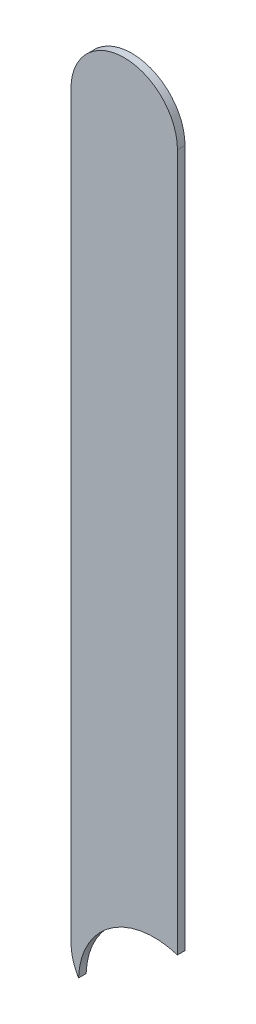
ISO-10303-21;
HEADER;
FILE_DESCRIPTION(('STEP AP214'),'2;1');
FILE_NAME('part.step','',(''),(''),'','','');
FILE_SCHEMA(('AUTOMOTIVE_DESIGN { 1 0 10303 214 1 1 1 1 }'));
ENDSEC;
DATA;
#1=APPLICATION_CONTEXT('core data for automotive mechanical design processes');
#2=APPLICATION_PROTOCOL_DEFINITION('international standard','automotive_design',2000,#1);
#3=PRODUCT_CONTEXT('',#1,'mechanical');
#4=PRODUCT('Part','Part','',(#3));
#5=PRODUCT_RELATED_PRODUCT_CATEGORY('part','',(#4));
#6=PRODUCT_DEFINITION_FORMATION('','',#4);
#7=PRODUCT_DEFINITION_CONTEXT('part definition',#1,'design');
#8=PRODUCT_DEFINITION('design','',#6,#7);
#9=PRODUCT_DEFINITION_SHAPE('','',#8);
#10=(LENGTH_UNIT() NAMED_UNIT(*) SI_UNIT(.MILLI.,.METRE.));
#11=(NAMED_UNIT(*) PLANE_ANGLE_UNIT() SI_UNIT($,.RADIAN.));
#12=(NAMED_UNIT(*) SI_UNIT($,.STERADIAN.) SOLID_ANGLE_UNIT());
#13=UNCERTAINTY_MEASURE_WITH_UNIT(LENGTH_MEASURE(1.E-05),#10,'distance_accuracy_value','');
#14=(GEOMETRIC_REPRESENTATION_CONTEXT(3) GLOBAL_UNCERTAINTY_ASSIGNED_CONTEXT((#13)) GLOBAL_UNIT_ASSIGNED_CONTEXT((#10,
#11,#12)) REPRESENTATION_CONTEXT('',''));
#15=CARTESIAN_POINT('',(0.,0.,0.));
#16=DIRECTION('',(0.,0.,1.));
#17=DIRECTION('',(1.,0.,0.));
#18=AXIS2_PLACEMENT_3D('',#15,#16,#17);
#19=CARTESIAN_POINT('',(89.14823166,106.156179013114,0.));
#20=DIRECTION('',(-1.,0.,0.));
#21=DIRECTION('',(0.,1.,0.));
#22=AXIS2_PLACEMENT_3D('',#19,#20,#21);
#23=PLANE('',#22);
#24=DIRECTION('',(0.,1.,0.));
#25=VECTOR('',#24,1.);
#26=CARTESIAN_POINT('',(89.14823166,105.9585384,0.03556));
#27=LINE('',#26,#25);
#28=CARTESIAN_POINT('',(89.14823166,106.156179013114,0.03556));
#29=VERTEX_POINT('',#28);
#30=CARTESIAN_POINT('',(89.14823166,109.43191728,0.03556));
#31=VERTEX_POINT('',#30);
#32=EDGE_CURVE('E11',#29,#31,#27,.T.);
#33=ORIENTED_EDGE('',*,*,#32,.F.);
#34=DIRECTION('',(0.,0.,1.));
#35=VECTOR('',#34,1.);
#36=CARTESIAN_POINT('',(89.14823166,106.156179013114,0.));
#37=LINE('',#36,#35);
#38=CARTESIAN_POINT('',(89.14823166,106.156179013114,0.));
#39=VERTEX_POINT('',#38);
#40=EDGE_CURVE('E24',#39,#29,#37,.T.);
#41=ORIENTED_EDGE('',*,*,#40,.F.);
#42=DIRECTION('',(0.,1.,0.));
#43=VECTOR('',#42,1.);
#44=CARTESIAN_POINT('',(89.14823166,105.9585384,0.));
#45=LINE('',#44,#43);
#46=CARTESIAN_POINT('',(89.14823166,109.43191728,0.));
#47=VERTEX_POINT('',#46);
#48=EDGE_CURVE('E82',#39,#47,#45,.T.);
#49=ORIENTED_EDGE('',*,*,#48,.T.);
#50=DIRECTION('',(0.,0.,1.));
#51=VECTOR('',#50,1.);
#52=CARTESIAN_POINT('',(89.14823166,109.43191728,0.));
#53=LINE('',#52,#51);
#54=EDGE_CURVE('E37',#47,#31,#53,.T.);
#55=ORIENTED_EDGE('',*,*,#54,.T.);
#56=EDGE_LOOP('',(#33,#41,#49,#55));
#57=FACE_BOUND('',#56,.T.);
#58=ADVANCED_FACE('F17',(#57),#23,.F.);
#59=CARTESIAN_POINT('',(88.89823216,109.43191728,0.));
#60=DIRECTION('',(0.,0.,-1.));
#61=DIRECTION('',(1.,1.13687065095739E-13,0.));
#62=AXIS2_PLACEMENT_3D('',#59,#60,#61);
#63=CYLINDRICAL_SURFACE('',#62,0.249999500000011);
#64=CARTESIAN_POINT('',(88.89823216,109.43191728,0.03556));
#65=DIRECTION('',(0.,0.,1.));
#66=DIRECTION('',(1.,1.13687065095739E-13,0.));
#67=AXIS2_PLACEMENT_3D('',#64,#65,#66);
#68=CIRCLE('',#67,0.249999500000011);
#69=CARTESIAN_POINT('',(88.64823266,109.43191728,0.03556));
#70=VERTEX_POINT('',#69);
#71=EDGE_CURVE('E98',#31,#70,#68,.T.);
#72=ORIENTED_EDGE('',*,*,#71,.F.);
#73=ORIENTED_EDGE('',*,*,#54,.F.);
#74=CARTESIAN_POINT('',(88.89823216,109.43191728,0.));
#75=DIRECTION('',(0.,0.,1.));
#76=DIRECTION('',(1.,1.13687065095739E-13,0.));
#77=AXIS2_PLACEMENT_3D('',#74,#75,#76);
#78=CIRCLE('',#77,0.249999500000011);
#79=CARTESIAN_POINT('',(88.64823266,109.43191728,0.));
#80=VERTEX_POINT('',#79);
#81=EDGE_CURVE('E95',#47,#80,#78,.T.);
#82=ORIENTED_EDGE('',*,*,#81,.T.);
#83=DIRECTION('',(0.,0.,1.));
#84=VECTOR('',#83,1.);
#85=CARTESIAN_POINT('',(88.64823266,109.43191728,0.));
#86=LINE('',#85,#84);
#87=EDGE_CURVE('E93',#80,#70,#86,.T.);
#88=ORIENTED_EDGE('',*,*,#87,.T.);
#89=EDGE_LOOP('',(#72,#73,#82,#88));
#90=FACE_BOUND('',#89,.T.);
#91=ADVANCED_FACE('F104',(#90),#63,.T.);
#92=CARTESIAN_POINT('',(88.64823266,109.43191728,0.));
#93=DIRECTION('',(1.,0.,0.));
#94=DIRECTION('',(0.,-1.,0.));
#95=AXIS2_PLACEMENT_3D('',#92,#93,#94);
#96=PLANE('',#95);
#97=DIRECTION('',(0.,-1.,0.));
#98=VECTOR('',#97,1.);
#99=CARTESIAN_POINT('',(88.64823266,109.43191728,0.03556));
#100=LINE('',#99,#98);
#101=CARTESIAN_POINT('',(88.64823266,105.9585384,0.03556));
#102=VERTEX_POINT('',#101);
#103=EDGE_CURVE('E90',#70,#102,#100,.T.);
#104=ORIENTED_EDGE('',*,*,#103,.F.);
#105=ORIENTED_EDGE('',*,*,#87,.F.);
#106=DIRECTION('',(0.,-1.,0.));
#107=VECTOR('',#106,1.);
#108=CARTESIAN_POINT('',(88.64823266,109.43191728,0.));
#109=LINE('',#108,#107);
#110=CARTESIAN_POINT('',(88.64823266,105.9585384,0.));
#111=VERTEX_POINT('',#110);
#112=EDGE_CURVE('E88',#80,#111,#109,.T.);
#113=ORIENTED_EDGE('',*,*,#112,.T.);
#114=DIRECTION('',(0.,0.,1.));
#115=VECTOR('',#114,1.);
#116=CARTESIAN_POINT('',(88.64823266,105.9585384,0.));
#117=LINE('',#116,#115);
#118=EDGE_CURVE('E73',#111,#102,#117,.T.);
#119=ORIENTED_EDGE('',*,*,#118,.T.);
#120=EDGE_LOOP('',(#104,#105,#113,#119));
#121=FACE_BOUND('',#120,.T.);
#122=ADVANCED_FACE('F109',(#121),#96,.F.);
#123=CARTESIAN_POINT('',(88.89823216,105.9585384,0.));
#124=DIRECTION('',(0.,0.,-1.));
#125=DIRECTION('',(-1.,0.,0.));
#126=AXIS2_PLACEMENT_3D('',#123,#124,#125);
#127=CYLINDRICAL_SURFACE('',#126,0.249999500000006);
#128=CARTESIAN_POINT('',(88.89823216,105.9585384,0.03556));
#129=DIRECTION('',(0.,0.,1.));
#130=DIRECTION('',(-1.,0.,0.));
#131=AXIS2_PLACEMENT_3D('',#128,#129,#130);
#132=CIRCLE('',#131,0.249999500000006);
#133=CARTESIAN_POINT('',(88.6836202249518,105.830314114722,0.03556));
#134=VERTEX_POINT('',#133);
#135=EDGE_CURVE('E77',#102,#134,#132,.T.);
#136=ORIENTED_EDGE('',*,*,#135,.F.);
#137=ORIENTED_EDGE('',*,*,#118,.F.);
#138=CARTESIAN_POINT('',(88.89823216,105.9585384,0.));
#139=DIRECTION('',(0.,0.,1.));
#140=DIRECTION('',(-1.,0.,0.));
#141=AXIS2_PLACEMENT_3D('',#138,#139,#140);
#142=CIRCLE('',#141,0.249999500000006);
#143=CARTESIAN_POINT('',(88.6836202249518,105.830314114722,0.));
#144=VERTEX_POINT('',#143);
#145=EDGE_CURVE('E69',#111,#144,#142,.T.);
#146=ORIENTED_EDGE('',*,*,#145,.T.);
#147=DIRECTION('',(0.,0.,1.));
#148=VECTOR('',#147,1.);
#149=CARTESIAN_POINT('',(88.6836202249518,105.830314114722,0.));
#150=LINE('',#149,#148);
#151=EDGE_CURVE('E59',#144,#134,#150,.T.);
#152=ORIENTED_EDGE('',*,*,#151,.T.);
#153=EDGE_LOOP('',(#136,#137,#146,#152));
#154=FACE_BOUND('',#153,.T.);
#155=ADVANCED_FACE('F72',(#154),#127,.T.);
#156=CARTESIAN_POINT('',(89.03899896,105.8177716,0.));
#157=DIRECTION('',(0.,0.,-1.));
#158=DIRECTION('',(1.,0.,0.));
#159=AXIS2_PLACEMENT_3D('',#156,#157,#158);
#160=CYLINDRICAL_SURFACE('',#159,0.3556);
#161=ORIENTED_EDGE('',*,*,#40,.T.);
#162=CARTESIAN_POINT('',(89.03899896,105.8177716,0.03556));
#163=DIRECTION('',(0.,0.,1.));
#164=DIRECTION('',(1.,0.,0.));
#165=AXIS2_PLACEMENT_3D('',#162,#163,#164);
#166=CIRCLE('',#165,0.3556);
#167=EDGE_CURVE('E65',#29,#134,#166,.T.);
#168=ORIENTED_EDGE('',*,*,#167,.T.);
#169=ORIENTED_EDGE('',*,*,#151,.F.);
#170=CARTESIAN_POINT('',(89.03899896,105.8177716,0.));
#171=DIRECTION('',(0.,0.,1.));
#172=DIRECTION('',(1.,0.,0.));
#173=AXIS2_PLACEMENT_3D('',#170,#171,#172);
#174=CIRCLE('',#173,0.3556);
#175=EDGE_CURVE('E63',#39,#144,#174,.T.);
#176=ORIENTED_EDGE('',*,*,#175,.F.);
#177=EDGE_LOOP('',(#161,#168,#169,#176));
#178=FACE_BOUND('',#177,.T.);
#179=ADVANCED_FACE('F61',(#178),#160,.F.);
#180=CARTESIAN_POINT('',(89.14823166,105.9585384,0.));
#181=DIRECTION('',(0.,0.,-1.));
#182=DIRECTION('',(-1.,0.,0.));
#183=AXIS2_PLACEMENT_3D('',#180,#181,#182);
#184=PLANE('',#183);
#185=ORIENTED_EDGE('',*,*,#48,.F.);
#186=ORIENTED_EDGE('',*,*,#175,.T.);
#187=ORIENTED_EDGE('',*,*,#145,.F.);
#188=ORIENTED_EDGE('',*,*,#112,.F.);
#189=ORIENTED_EDGE('',*,*,#81,.F.);
#190=EDGE_LOOP('',(#185,#186,#187,#188,#189));
#191=FACE_BOUND('',#190,.T.);
#192=ADVANCED_FACE('F80',(#191),#184,.T.);
#193=CARTESIAN_POINT('',(89.14823166,105.9585384,0.03556));
#194=DIRECTION('',(0.,0.,-1.));
#195=DIRECTION('',(-1.,0.,0.));
#196=AXIS2_PLACEMENT_3D('',#193,#194,#195);
#197=PLANE('',#196);
#198=ORIENTED_EDGE('',*,*,#167,.F.);
#199=ORIENTED_EDGE('',*,*,#32,.T.);
#200=ORIENTED_EDGE('',*,*,#71,.T.);
#201=ORIENTED_EDGE('',*,*,#103,.T.);
#202=ORIENTED_EDGE('',*,*,#135,.T.);
#203=EDGE_LOOP('',(#198,#199,#200,#201,#202));
#204=FACE_BOUND('',#203,.T.);
#205=ADVANCED_FACE('F107',(#204),#197,.F.);
#206=CLOSED_SHELL('',(#58,#91,#122,#155,#179,#192,#205));
#207=MANIFOLD_SOLID_BREP('B1',#206);
#208=ADVANCED_BREP_SHAPE_REPRESENTATION('',(#18,#207),#14);
#209=SHAPE_DEFINITION_REPRESENTATION(#9,#208);
ENDSEC;
END-ISO-10303-21;
